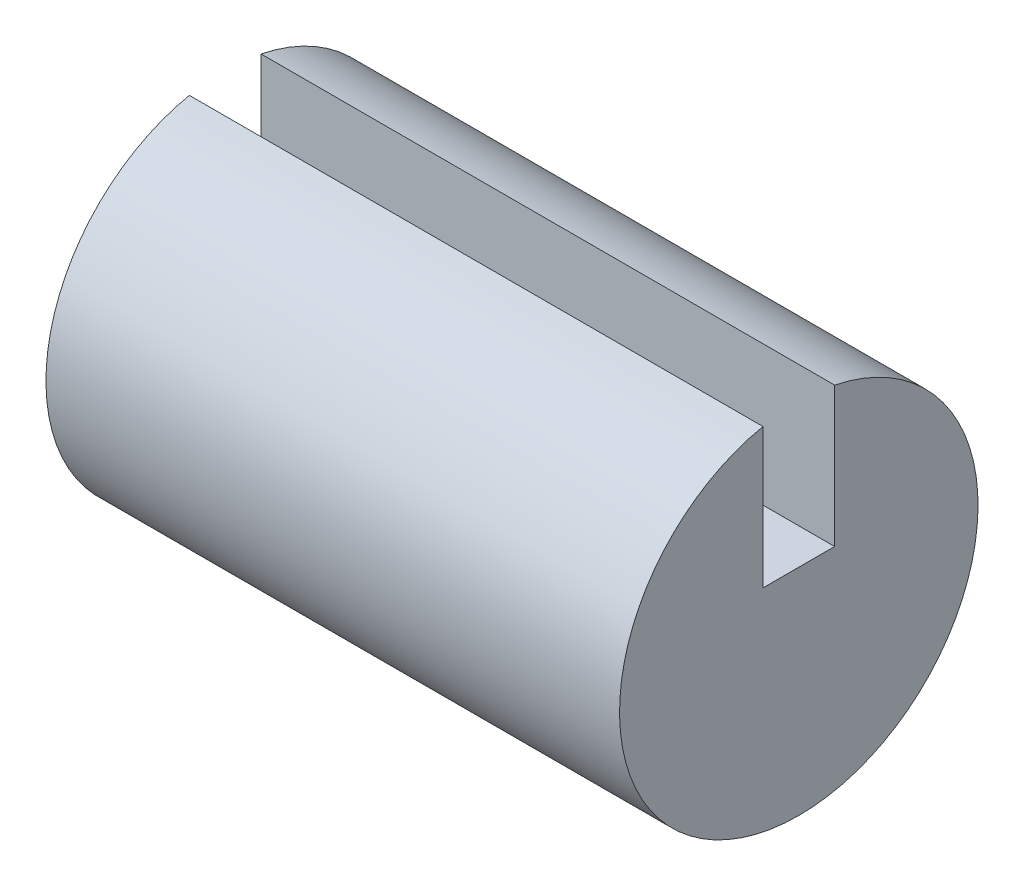
ISO-10303-21;
HEADER;
FILE_DESCRIPTION(('STEP AP214'),'2;1');
FILE_NAME('part.step','',(''),(''),'','','');
FILE_SCHEMA(('AUTOMOTIVE_DESIGN { 1 0 10303 214 1 1 1 1 }'));
ENDSEC;
DATA;
#1=APPLICATION_CONTEXT('core data for automotive mechanical design processes');
#2=APPLICATION_PROTOCOL_DEFINITION('international standard','automotive_design',2000,#1);
#3=PRODUCT_CONTEXT('',#1,'mechanical');
#4=PRODUCT('Part','Part','',(#3));
#5=PRODUCT_RELATED_PRODUCT_CATEGORY('part','',(#4));
#6=PRODUCT_DEFINITION_FORMATION('','',#4);
#7=PRODUCT_DEFINITION_CONTEXT('part definition',#1,'design');
#8=PRODUCT_DEFINITION('design','',#6,#7);
#9=PRODUCT_DEFINITION_SHAPE('','',#8);
#10=(LENGTH_UNIT() NAMED_UNIT(*) SI_UNIT(.MILLI.,.METRE.));
#11=(NAMED_UNIT(*) PLANE_ANGLE_UNIT() SI_UNIT($,.RADIAN.));
#12=(NAMED_UNIT(*) SI_UNIT($,.STERADIAN.) SOLID_ANGLE_UNIT());
#13=UNCERTAINTY_MEASURE_WITH_UNIT(LENGTH_MEASURE(1.E-05),#10,'distance_accuracy_value','');
#14=(GEOMETRIC_REPRESENTATION_CONTEXT(3) GLOBAL_UNCERTAINTY_ASSIGNED_CONTEXT((#13)) GLOBAL_UNIT_ASSIGNED_CONTEXT((#10,
#11,#12)) REPRESENTATION_CONTEXT('',''));
#15=CARTESIAN_POINT('',(0.,0.,0.));
#16=DIRECTION('',(0.,0.,1.));
#17=DIRECTION('',(1.,0.,0.));
#18=AXIS2_PLACEMENT_3D('',#15,#16,#17);
#19=CARTESIAN_POINT('',(8.,0.,0.));
#20=DIRECTION('',(-1.,0.,0.));
#21=DIRECTION('',(0.,0.,1.));
#22=AXIS2_PLACEMENT_3D('',#19,#20,#21);
#23=CYLINDRICAL_SURFACE('',#22,2.5);
#24=CARTESIAN_POINT('',(4.,-2.44948974278318,0.500000000000001));
#25=CARTESIAN_POINT('',(4.02778218774099,-2.44949029521966,0.499998972938023));
#26=CARTESIAN_POINT('',(4.05557731165325,-2.44996754173456,0.497676585861829));
#27=CARTESIAN_POINT('',(4.1103812525592,-2.45182215692631,0.488456141794168));
#28=CARTESIAN_POINT('',(4.13738942231554,-2.45320024583166,0.481554423535591));
#29=CARTESIAN_POINT('',(4.18981865168147,-2.45669436850178,0.46339789130887));
#30=CARTESIAN_POINT('',(4.21524126076746,-2.45880966807656,0.452147407076042));
#31=CARTESIAN_POINT('',(4.26383742234731,-2.4635389974321,0.425624553835522));
#32=CARTESIAN_POINT('',(4.28701110026864,-2.46615299937507,0.410352409300648));
#33=CARTESIAN_POINT('',(4.33078050192725,-2.4716264984634,0.375989537826645));
#34=CARTESIAN_POINT('',(4.35133979394207,-2.47448868918412,0.35685282795664));
#35=CARTESIAN_POINT('',(4.3889787667894,-2.4801123615151,0.315403394510676));
#36=CARTESIAN_POINT('',(4.40605820370857,-2.48287383605473,0.293090448488998));
#37=CARTESIAN_POINT('',(4.43639400881425,-2.48801398208724,0.245680677962123));
#38=CARTESIAN_POINT('',(4.44961575690833,-2.4903891072076,0.220561283836104));
#39=CARTESIAN_POINT('',(4.47163746852406,-2.49445868441831,0.168402075193638));
#40=CARTESIAN_POINT('',(4.48043784595049,-2.49615320022064,0.141362440710277));
#41=CARTESIAN_POINT('',(4.49325359680982,-2.49865160344205,0.0865083866392468));
#42=CARTESIAN_POINT('',(4.49733048878551,-2.49946693144062,0.0587088696074069));
#43=CARTESIAN_POINT('',(4.50077547591916,-2.50015460591803,0.00280928421876818));
#44=CARTESIAN_POINT('',(4.50014402482291,-2.5000270432638,-0.0252907549159217));
#45=CARTESIAN_POINT('',(4.49423690989222,-2.49885217434257,-0.0805710003717946));
#46=CARTESIAN_POINT('',(4.48902751141608,-2.49781799182919,-0.107758607149235));
#47=CARTESIAN_POINT('',(4.47421748377055,-2.49496088579704,-0.160865813290151));
#48=CARTESIAN_POINT('',(4.46461667890406,-2.49313793072019,-0.186785361873565));
#49=CARTESIAN_POINT('',(4.44123497992637,-2.48888648009979,-0.236809731600444));
#50=CARTESIAN_POINT('',(4.42742812444756,-2.48645424087612,-0.26090208706695));
#51=CARTESIAN_POINT('',(4.3960454613817,-2.48125234736893,-0.306452522929879));
#52=CARTESIAN_POINT('',(4.37846922011474,-2.47848265427611,-0.327910299762501));
#53=CARTESIAN_POINT('',(4.33968318894576,-2.4728548218223,-0.367975715526729));
#54=CARTESIAN_POINT('',(4.31841540663521,-2.46999598228758,-0.386527158286816));
#55=CARTESIAN_POINT('',(4.27304177877462,-2.4645578579938,-0.419809246588404));
#56=CARTESIAN_POINT('',(4.2489358795584,-2.46197857852274,-0.434539819863876));
#57=CARTESIAN_POINT('',(4.1984895840891,-2.45739023736462,-0.459781407400941));
#58=CARTESIAN_POINT('',(4.17214451618017,-2.45538240781774,-0.470283323888856));
#59=CARTESIAN_POINT('',(4.118014338138,-2.45218238160636,-0.486695170813792));
#60=CARTESIAN_POINT('',(4.09022941619046,-2.45099007864214,-0.492605699728322));
#61=CARTESIAN_POINT('',(4.03451757100048,-2.44957739633914,-0.499583003018026));
#62=CARTESIAN_POINT('',(4.00660121284483,-2.44934073528577,-0.500730929448956));
#63=CARTESIAN_POINT('',(3.95097588840016,-2.44982242844427,-0.49836881415537));
#64=CARTESIAN_POINT('',(3.92326691044057,-2.45054072850194,-0.494859036561222));
#65=CARTESIAN_POINT('',(3.86911567985388,-2.45283616247457,-0.483351104037079));
#66=CARTESIAN_POINT('',(3.84266382848212,-2.45440499507248,-0.47539631041965));
#67=CARTESIAN_POINT('',(3.79146836048563,-2.45821744675832,-0.455270517654259));
#68=CARTESIAN_POINT('',(3.76672488478214,-2.46046112143135,-0.443099171186589));
#69=CARTESIAN_POINT('',(3.71929344502492,-2.4654070298102,-0.4147020711078));
#70=CARTESIAN_POINT('',(3.69663647684959,-2.46811485932452,-0.398425538991377));
#71=CARTESIAN_POINT('',(3.65434584399954,-2.47366861913318,-0.362347786106356));
#72=CARTESIAN_POINT('',(3.63471249087537,-2.47651456361909,-0.342546202572269));
#73=CARTESIAN_POINT('',(3.59871872040721,-2.48207672934608,-0.299616136748945));
#74=CARTESIAN_POINT('',(3.582413172675,-2.48479028854342,-0.276441249464815));
#75=CARTESIAN_POINT('',(3.55392705925021,-2.4897356381431,-0.227633948317378));
#76=CARTESIAN_POINT('',(3.54174632032761,-2.49196744877605,-0.202001637716753));
#77=CARTESIAN_POINT('',(3.52193556412668,-2.49568647030533,-0.149151340412006));
#78=CARTESIAN_POINT('',(3.51427974088687,-2.49717789571302,-0.121943336739039));
#79=CARTESIAN_POINT('',(3.50365437616808,-2.4992661796883,-0.0665947273399563));
#80=CARTESIAN_POINT('',(3.50068427026216,-2.49986314599922,-0.0384542343556071));
#81=CARTESIAN_POINT('',(3.49953650951856,-2.5000927022706,0.0174364469518118));
#82=CARTESIAN_POINT('',(3.50127635977189,-2.49974189274675,0.0451849060707513));
#83=CARTESIAN_POINT('',(3.50931697527391,-2.49815021780159,0.099985515657821));
#84=CARTESIAN_POINT('',(3.51561768317404,-2.49690936357176,0.127037674876846));
#85=CARTESIAN_POINT('',(3.53256449604582,-2.493677491825,0.179626374872548));
#86=CARTESIAN_POINT('',(3.54320068906559,-2.49168818623956,0.205166221620141));
#87=CARTESIAN_POINT('',(3.56850612066545,-2.48717361061691,0.254110610092977));
#88=CARTESIAN_POINT('',(3.58317567795186,-2.48464829822939,0.277514982883706));
#89=CARTESIAN_POINT('',(3.61640969353104,-2.47928799578934,0.321931945053179));
#90=CARTESIAN_POINT('',(3.63503316819338,-2.47644866711071,0.342899858058252));
#91=CARTESIAN_POINT('',(3.67552512004789,-2.47080611451811,0.381441308878423));
#92=CARTESIAN_POINT('',(3.69739436473437,-2.46800289931437,0.399014041601356));
#93=CARTESIAN_POINT('',(3.74403965835009,-2.46271671374982,0.430446109727601));
#94=CARTESIAN_POINT('',(3.76884448058018,-2.46023751815664,0.444263407319884));
#95=CARTESIAN_POINT('',(3.82046638664985,-2.45592618592222,0.467512024643905));
#96=CARTESIAN_POINT('',(3.84728161934896,-2.45409346268478,0.476947322989646));
#97=CARTESIAN_POINT('',(3.89513122771828,-2.45164840564461,0.489334569927137));
#98=CARTESIAN_POINT('',(3.91589270975573,-2.4508439245783,0.493326949261494));
#99=CARTESIAN_POINT('',(3.95776697727682,-2.44976439229015,0.498660008980205));
#100=CARTESIAN_POINT('',(3.97887975062409,-2.44948932281638,0.500000780781028));
#101=CARTESIAN_POINT('',(4.,-2.44948974278318,0.500000000000001));
#102=B_SPLINE_CURVE_WITH_KNOTS('',3,(#24,#25,#26,#27,#28,#29,#30,#31,#32,#33,#34,#35,#36,#37,
#38,#39,#40,#41,#42,#43,#44,#45,#46,#47,#48,#49,#50,#51,#52,#53,#54,#55,#56,#57,#58,#59,#60,#61,
#62,#63,#64,#65,#66,#67,#68,#69,#70,#71,#72,#73,#74,#75,#76,#77,#78,#79,#80,#81,#82,#83,#84,#85,
#86,#87,#88,#89,#90,#91,#92,#93,#94,#95,#96,#97,#98,#99,#100,#101),.UNSPECIFIED.,.T.,.F.,(4,2,2,
2,2,2,2,2,2,2,2,2,2,2,2,2,2,2,2,2,2,2,2,2,2,2,2,2,2,2,2,2,2,2,2,2,2,2,4),(0.,0.0832692319282617,
0.166605119629632,0.249858248957777,0.333106732417417,0.417411262729667,0.501721700164594,
0.586767002174736,0.671804341220284,0.755721244402887,0.839630060568727,0.922343948155173,
1.00506114535624,1.088299621099,1.17154767883782,1.2562467337999,1.34094739060109,
1.42582931585137,1.51070017506761,1.59411878901045,1.67753267262959,1.76014670890408,
1.84276755175948,1.92646529886009,2.01017166433853,2.09516300865474,2.18015078313801,
2.26464906788074,2.34913717344563,2.43215508706092,2.51517195682127,2.59800008536475,
2.68083476066091,2.76500576011547,2.84919669443639,2.93429449288269,3.01931487543215,
3.08261901817197,3.14592097840856),.UNSPECIFIED.);
#103=CARTESIAN_POINT('',(4.,-2.44948974278318,0.500000000000001));
#104=VERTEX_POINT('',#103);
#105=EDGE_CURVE('E115',#104,#104,#102,.T.);
#106=ORIENTED_EDGE('',*,*,#105,.T.);
#107=EDGE_LOOP('',(#106));
#108=FACE_BOUND('',#107,.T.);
#109=CARTESIAN_POINT('',(0.,0.,0.));
#110=DIRECTION('',(1.,0.,0.));
#111=DIRECTION('',(0.,0.,-1.));
#112=AXIS2_PLACEMENT_3D('',#109,#110,#111);
#113=CIRCLE('',#112,2.5);
#114=CARTESIAN_POINT('',(0.,2.44948974278318,0.5));
#115=VERTEX_POINT('',#114);
#116=CARTESIAN_POINT('',(0.,2.44948974278318,-0.5));
#117=VERTEX_POINT('',#116);
#118=EDGE_CURVE('E119',#115,#117,#113,.T.);
#119=ORIENTED_EDGE('',*,*,#118,.T.);
#120=DIRECTION('',(-1.,0.,0.));
#121=VECTOR('',#120,1.);
#122=CARTESIAN_POINT('',(8.,2.44948974278318,-0.5));
#123=LINE('',#122,#121);
#124=CARTESIAN_POINT('',(8.,2.44948974278318,-0.5));
#125=VERTEX_POINT('',#124);
#126=EDGE_CURVE('E90',#117,#125,#123,.F.);
#127=ORIENTED_EDGE('',*,*,#126,.T.);
#128=CARTESIAN_POINT('',(8.,0.,0.));
#129=DIRECTION('',(1.,0.,0.));
#130=DIRECTION('',(0.,0.,-1.));
#131=AXIS2_PLACEMENT_3D('',#128,#129,#130);
#132=CIRCLE('',#131,2.5);
#133=CARTESIAN_POINT('',(8.,2.44948974278318,0.5));
#134=VERTEX_POINT('',#133);
#135=EDGE_CURVE('E116',#134,#125,#132,.T.);
#136=ORIENTED_EDGE('',*,*,#135,.F.);
#137=DIRECTION('',(-1.,0.,0.));
#138=VECTOR('',#137,1.);
#139=CARTESIAN_POINT('',(8.,2.44948974278318,0.5));
#140=LINE('',#139,#138);
#141=EDGE_CURVE('E83',#134,#115,#140,.T.);
#142=ORIENTED_EDGE('',*,*,#141,.T.);
#143=EDGE_LOOP('',(#119,#127,#136,#142));
#144=FACE_BOUND('',#143,.T.);
#145=ADVANCED_FACE('F35',(#108,#144),#23,.T.);
#146=CARTESIAN_POINT('',(8.,0.,0.));
#147=DIRECTION('',(1.,0.,0.));
#148=DIRECTION('',(0.,0.,-1.));
#149=AXIS2_PLACEMENT_3D('',#146,#147,#148);
#150=PLANE('',#149);
#151=DIRECTION('',(0.,1.,0.));
#152=VECTOR('',#151,1.);
#153=CARTESIAN_POINT('',(8.,4.5,-0.5));
#154=LINE('',#153,#152);
#155=CARTESIAN_POINT('',(8.,0.5,-0.5));
#156=VERTEX_POINT('',#155);
#157=EDGE_CURVE('E106',#156,#125,#154,.T.);
#158=ORIENTED_EDGE('',*,*,#157,.F.);
#159=DIRECTION('',(0.,0.,-1.));
#160=VECTOR('',#159,1.);
#161=CARTESIAN_POINT('',(8.,0.5,0.5));
#162=LINE('',#161,#160);
#163=CARTESIAN_POINT('',(8.,0.5,0.5));
#164=VERTEX_POINT('',#163);
#165=EDGE_CURVE('E95',#164,#156,#162,.T.);
#166=ORIENTED_EDGE('',*,*,#165,.F.);
#167=DIRECTION('',(0.,-1.,0.));
#168=VECTOR('',#167,1.);
#169=CARTESIAN_POINT('',(8.,4.5,0.5));
#170=LINE('',#169,#168);
#171=EDGE_CURVE('E108',#134,#164,#170,.T.);
#172=ORIENTED_EDGE('',*,*,#171,.F.);
#173=ORIENTED_EDGE('',*,*,#135,.T.);
#174=EDGE_LOOP('',(#158,#166,#172,#173));
#175=FACE_BOUND('',#174,.T.);
#176=ADVANCED_FACE('F132',(#175),#150,.T.);
#177=CARTESIAN_POINT('',(0.,0.,0.));
#178=DIRECTION('',(1.,0.,0.));
#179=DIRECTION('',(0.,0.,-1.));
#180=AXIS2_PLACEMENT_3D('',#177,#178,#179);
#181=PLANE('',#180);
#182=DIRECTION('',(0.,0.,-1.));
#183=VECTOR('',#182,1.);
#184=CARTESIAN_POINT('',(0.,0.5,0.5));
#185=LINE('',#184,#183);
#186=CARTESIAN_POINT('',(0.,0.5,0.5));
#187=VERTEX_POINT('',#186);
#188=CARTESIAN_POINT('',(0.,0.5,-0.5));
#189=VERTEX_POINT('',#188);
#190=EDGE_CURVE('E50',#187,#189,#185,.T.);
#191=ORIENTED_EDGE('',*,*,#190,.T.);
#192=DIRECTION('',(0.,1.,0.));
#193=VECTOR('',#192,1.);
#194=CARTESIAN_POINT('',(0.,4.5,-0.5));
#195=LINE('',#194,#193);
#196=EDGE_CURVE('E87',#189,#117,#195,.T.);
#197=ORIENTED_EDGE('',*,*,#196,.T.);
#198=ORIENTED_EDGE('',*,*,#118,.F.);
#199=DIRECTION('',(0.,-1.,0.));
#200=VECTOR('',#199,1.);
#201=CARTESIAN_POINT('',(0.,4.5,0.5));
#202=LINE('',#201,#200);
#203=EDGE_CURVE('E94',#115,#187,#202,.T.);
#204=ORIENTED_EDGE('',*,*,#203,.T.);
#205=EDGE_LOOP('',(#191,#197,#198,#204));
#206=FACE_BOUND('',#205,.T.);
#207=ADVANCED_FACE('F98',(#206),#181,.F.);
#208=CARTESIAN_POINT('',(4.,-4.,0.));
#209=DIRECTION('',(0.,1.,0.));
#210=DIRECTION('',(0.,0.,1.));
#211=AXIS2_PLACEMENT_3D('',#208,#209,#210);
#212=CYLINDRICAL_SURFACE('',#211,0.500000000000001);
#213=CARTESIAN_POINT('',(4.,0.5,0.));
#214=DIRECTION('',(0.,-1.,0.));
#215=DIRECTION('',(0.,0.,-1.));
#216=AXIS2_PLACEMENT_3D('',#213,#214,#215);
#217=CIRCLE('',#216,0.500000000000001);
#218=CARTESIAN_POINT('',(4.,0.5,0.5));
#219=VERTEX_POINT('',#218);
#220=CARTESIAN_POINT('',(4.,0.5,-0.5));
#221=VERTEX_POINT('',#220);
#222=EDGE_CURVE('E39',#219,#221,#217,.F.);
#223=ORIENTED_EDGE('',*,*,#222,.T.);
#224=EDGE_CURVE('E11',#221,#219,#217,.F.);
#225=ORIENTED_EDGE('',*,*,#224,.T.);
#226=EDGE_LOOP('',(#223,#225));
#227=FACE_BOUND('',#226,.T.);
#228=ORIENTED_EDGE('',*,*,#105,.F.);
#229=EDGE_LOOP('',(#228));
#230=FACE_BOUND('',#229,.T.);
#231=ADVANCED_FACE('F125',(#227,#230),#212,.F.);
#232=CARTESIAN_POINT('',(0.,4.5,-0.5));
#233=DIRECTION('',(0.,0.,-1.));
#234=DIRECTION('',(0.,1.,0.));
#235=AXIS2_PLACEMENT_3D('',#232,#233,#234);
#236=PLANE('',#235);
#237=ORIENTED_EDGE('',*,*,#196,.F.);
#238=DIRECTION('',(1.,0.,0.));
#239=VECTOR('',#238,1.);
#240=CARTESIAN_POINT('',(0.,0.5,-0.5));
#241=LINE('',#240,#239);
#242=EDGE_CURVE('E57',#189,#221,#241,.T.);
#243=ORIENTED_EDGE('',*,*,#242,.T.);
#244=EDGE_CURVE('E84',#221,#156,#241,.T.);
#245=ORIENTED_EDGE('',*,*,#244,.T.);
#246=ORIENTED_EDGE('',*,*,#157,.T.);
#247=ORIENTED_EDGE('',*,*,#126,.F.);
#248=EDGE_LOOP('',(#237,#243,#245,#246,#247));
#249=FACE_BOUND('',#248,.T.);
#250=ADVANCED_FACE('F88',(#249),#236,.F.);
#251=CARTESIAN_POINT('',(0.,0.5,0.5));
#252=DIRECTION('',(0.,-1.,0.));
#253=DIRECTION('',(0.,0.,-1.));
#254=AXIS2_PLACEMENT_3D('',#251,#252,#253);
#255=PLANE('',#254);
#256=ORIENTED_EDGE('',*,*,#242,.F.);
#257=ORIENTED_EDGE('',*,*,#190,.F.);
#258=DIRECTION('',(1.,0.,0.));
#259=VECTOR('',#258,1.);
#260=CARTESIAN_POINT('',(0.,0.5,0.5));
#261=LINE('',#260,#259);
#262=EDGE_CURVE('E102',#187,#219,#261,.T.);
#263=ORIENTED_EDGE('',*,*,#262,.T.);
#264=ORIENTED_EDGE('',*,*,#224,.F.);
#265=EDGE_LOOP('',(#256,#257,#263,#264));
#266=FACE_BOUND('',#265,.T.);
#267=ADVANCED_FACE('F81',(#266),#255,.F.);
#268=EDGE_CURVE('E100',#219,#164,#261,.T.);
#269=ORIENTED_EDGE('',*,*,#268,.T.);
#270=ORIENTED_EDGE('',*,*,#165,.T.);
#271=ORIENTED_EDGE('',*,*,#244,.F.);
#272=ORIENTED_EDGE('',*,*,#222,.F.);
#273=EDGE_LOOP('',(#269,#270,#271,#272));
#274=FACE_BOUND('',#273,.T.);
#275=ADVANCED_FACE('F151',(#274),#255,.F.);
#276=CARTESIAN_POINT('',(0.,4.5,0.5));
#277=DIRECTION('',(0.,0.,1.));
#278=DIRECTION('',(0.,-1.,0.));
#279=AXIS2_PLACEMENT_3D('',#276,#277,#278);
#280=PLANE('',#279);
#281=ORIENTED_EDGE('',*,*,#171,.T.);
#282=ORIENTED_EDGE('',*,*,#268,.F.);
#283=ORIENTED_EDGE('',*,*,#262,.F.);
#284=ORIENTED_EDGE('',*,*,#203,.F.);
#285=ORIENTED_EDGE('',*,*,#141,.F.);
#286=EDGE_LOOP('',(#281,#282,#283,#284,#285));
#287=FACE_BOUND('',#286,.T.);
#288=ADVANCED_FACE('F147',(#287),#280,.F.);
#289=CLOSED_SHELL('',(#145,#176,#207,#231,#250,#267,#275,#288));
#290=MANIFOLD_SOLID_BREP('B2',#289);
#291=ADVANCED_BREP_SHAPE_REPRESENTATION('',(#18,#290),#14);
#292=SHAPE_DEFINITION_REPRESENTATION(#9,#291);
ENDSEC;
END-ISO-10303-21;
